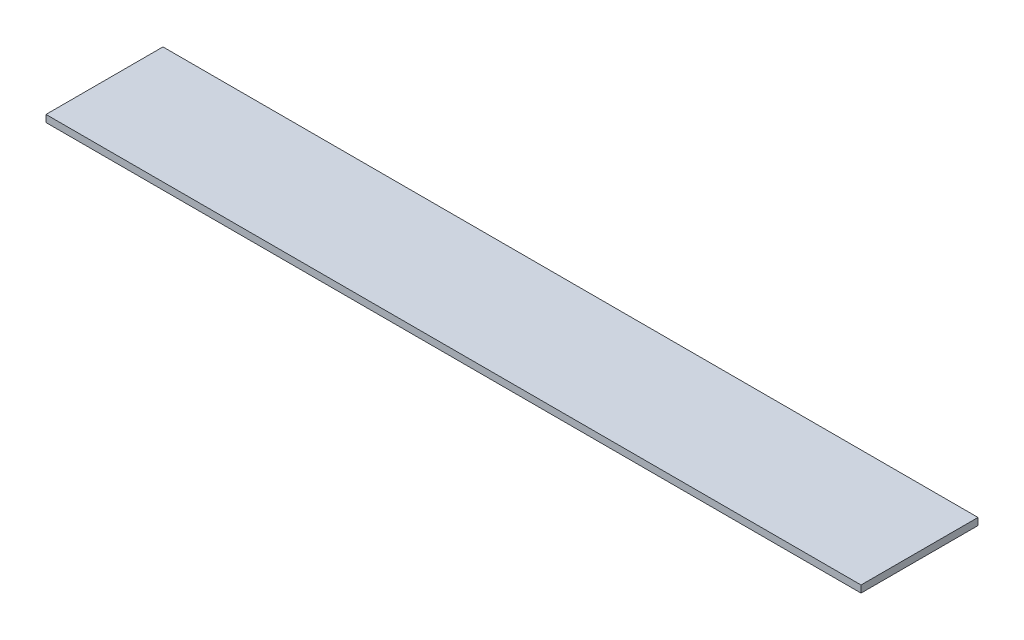
ISO-10303-21;
HEADER;
FILE_DESCRIPTION(('STEP AP214'),'2;1');
FILE_NAME('part.step','',(''),(''),'','','');
FILE_SCHEMA(('AUTOMOTIVE_DESIGN { 1 0 10303 214 1 1 1 1 }'));
ENDSEC;
DATA;
#1=APPLICATION_CONTEXT('core data for automotive mechanical design processes');
#2=APPLICATION_PROTOCOL_DEFINITION('international standard','automotive_design',2000,#1);
#3=PRODUCT_CONTEXT('',#1,'mechanical');
#4=PRODUCT('Part','Part','',(#3));
#5=PRODUCT_RELATED_PRODUCT_CATEGORY('part','',(#4));
#6=PRODUCT_DEFINITION_FORMATION('','',#4);
#7=PRODUCT_DEFINITION_CONTEXT('part definition',#1,'design');
#8=PRODUCT_DEFINITION('design','',#6,#7);
#9=PRODUCT_DEFINITION_SHAPE('','',#8);
#10=(LENGTH_UNIT() NAMED_UNIT(*) SI_UNIT(.MILLI.,.METRE.));
#11=(NAMED_UNIT(*) PLANE_ANGLE_UNIT() SI_UNIT($,.RADIAN.));
#12=(NAMED_UNIT(*) SI_UNIT($,.STERADIAN.) SOLID_ANGLE_UNIT());
#13=UNCERTAINTY_MEASURE_WITH_UNIT(LENGTH_MEASURE(1.E-05),#10,'distance_accuracy_value','');
#14=(GEOMETRIC_REPRESENTATION_CONTEXT(3) GLOBAL_UNCERTAINTY_ASSIGNED_CONTEXT((#13)) GLOBAL_UNIT_ASSIGNED_CONTEXT((#10,
#11,#12)) REPRESENTATION_CONTEXT('',''));
#15=CARTESIAN_POINT('',(0.,0.,0.));
#16=DIRECTION('',(0.,0.,1.));
#17=DIRECTION('',(1.,0.,0.));
#18=AXIS2_PLACEMENT_3D('',#15,#16,#17);
#19=CARTESIAN_POINT('',(-685.8,11.8872,-98.425));
#20=DIRECTION('',(1.,0.,0.));
#21=DIRECTION('',(0.,0.,-1.));
#22=AXIS2_PLACEMENT_3D('',#19,#20,#21);
#23=PLANE('',#22);
#24=DIRECTION('',(0.,0.,1.));
#25=VECTOR('',#24,1.);
#26=CARTESIAN_POINT('',(-685.8,0.,-98.425));
#27=LINE('',#26,#25);
#28=CARTESIAN_POINT('',(-685.8,0.,-98.425));
#29=VERTEX_POINT('',#28);
#30=CARTESIAN_POINT('',(-685.8,0.,98.425));
#31=VERTEX_POINT('',#30);
#32=EDGE_CURVE('E96',#29,#31,#27,.T.);
#33=ORIENTED_EDGE('',*,*,#32,.T.);
#34=DIRECTION('',(0.,-1.,0.));
#35=VECTOR('',#34,1.);
#36=CARTESIAN_POINT('',(-685.8,11.8872,98.425));
#37=LINE('',#36,#35);
#38=CARTESIAN_POINT('',(-685.8,11.8872,98.425));
#39=VERTEX_POINT('',#38);
#40=EDGE_CURVE('E11',#39,#31,#37,.T.);
#41=ORIENTED_EDGE('',*,*,#40,.F.);
#42=DIRECTION('',(0.,0.,1.));
#43=VECTOR('',#42,1.);
#44=CARTESIAN_POINT('',(-685.8,11.8872,-98.425));
#45=LINE('',#44,#43);
#46=CARTESIAN_POINT('',(-685.8,11.8872,-98.425));
#47=VERTEX_POINT('',#46);
#48=EDGE_CURVE('E84',#47,#39,#45,.T.);
#49=ORIENTED_EDGE('',*,*,#48,.F.);
#50=DIRECTION('',(0.,-1.,0.));
#51=VECTOR('',#50,1.);
#52=CARTESIAN_POINT('',(-685.8,11.8872,-98.425));
#53=LINE('',#52,#51);
#54=EDGE_CURVE('E92',#47,#29,#53,.T.);
#55=ORIENTED_EDGE('',*,*,#54,.T.);
#56=EDGE_LOOP('',(#33,#41,#49,#55));
#57=FACE_BOUND('',#56,.T.);
#58=ADVANCED_FACE('F33',(#57),#23,.F.);
#59=CARTESIAN_POINT('',(685.8,11.8872,98.425));
#60=DIRECTION('',(0.,0.,-1.));
#61=DIRECTION('',(-1.,0.,0.));
#62=AXIS2_PLACEMENT_3D('',#59,#60,#61);
#63=PLANE('',#62);
#64=DIRECTION('',(1.,0.,0.));
#65=VECTOR('',#64,1.);
#66=CARTESIAN_POINT('',(685.8,0.,98.425));
#67=LINE('',#66,#65);
#68=CARTESIAN_POINT('',(685.8,0.,98.425));
#69=VERTEX_POINT('',#68);
#70=EDGE_CURVE('E88',#31,#69,#67,.T.);
#71=ORIENTED_EDGE('',*,*,#70,.T.);
#72=DIRECTION('',(0.,-1.,0.));
#73=VECTOR('',#72,1.);
#74=CARTESIAN_POINT('',(685.8,11.8872,98.425));
#75=LINE('',#74,#73);
#76=CARTESIAN_POINT('',(685.8,11.8872,98.425));
#77=VERTEX_POINT('',#76);
#78=EDGE_CURVE('E41',#77,#69,#75,.T.);
#79=ORIENTED_EDGE('',*,*,#78,.F.);
#80=DIRECTION('',(1.,0.,0.));
#81=VECTOR('',#80,1.);
#82=CARTESIAN_POINT('',(685.8,11.8872,98.425));
#83=LINE('',#82,#81);
#84=EDGE_CURVE('E79',#39,#77,#83,.T.);
#85=ORIENTED_EDGE('',*,*,#84,.F.);
#86=ORIENTED_EDGE('',*,*,#40,.T.);
#87=EDGE_LOOP('',(#71,#79,#85,#86));
#88=FACE_BOUND('',#87,.T.);
#89=ADVANCED_FACE('F87',(#88),#63,.F.);
#90=CARTESIAN_POINT('',(685.8,11.8872,-98.425));
#91=DIRECTION('',(-1.,0.,0.));
#92=DIRECTION('',(0.,0.,1.));
#93=AXIS2_PLACEMENT_3D('',#90,#91,#92);
#94=PLANE('',#93);
#95=DIRECTION('',(0.,0.,-1.));
#96=VECTOR('',#95,1.);
#97=CARTESIAN_POINT('',(685.8,0.,-98.425));
#98=LINE('',#97,#96);
#99=CARTESIAN_POINT('',(685.8,0.,-98.425));
#100=VERTEX_POINT('',#99);
#101=EDGE_CURVE('E66',#69,#100,#98,.T.);
#102=ORIENTED_EDGE('',*,*,#101,.T.);
#103=DIRECTION('',(0.,-1.,0.));
#104=VECTOR('',#103,1.);
#105=CARTESIAN_POINT('',(685.8,11.8872,-98.425));
#106=LINE('',#105,#104);
#107=CARTESIAN_POINT('',(685.8,11.8872,-98.425));
#108=VERTEX_POINT('',#107);
#109=EDGE_CURVE('E89',#108,#100,#106,.T.);
#110=ORIENTED_EDGE('',*,*,#109,.F.);
#111=DIRECTION('',(0.,0.,-1.));
#112=VECTOR('',#111,1.);
#113=CARTESIAN_POINT('',(685.8,11.8872,-98.425));
#114=LINE('',#113,#112);
#115=EDGE_CURVE('E82',#77,#108,#114,.T.);
#116=ORIENTED_EDGE('',*,*,#115,.F.);
#117=ORIENTED_EDGE('',*,*,#78,.T.);
#118=EDGE_LOOP('',(#102,#110,#116,#117));
#119=FACE_BOUND('',#118,.T.);
#120=ADVANCED_FACE('F90',(#119),#94,.F.);
#121=CARTESIAN_POINT('',(685.8,11.8872,-98.425));
#122=DIRECTION('',(0.,0.,1.));
#123=DIRECTION('',(1.,0.,0.));
#124=AXIS2_PLACEMENT_3D('',#121,#122,#123);
#125=PLANE('',#124);
#126=DIRECTION('',(-1.,0.,0.));
#127=VECTOR('',#126,1.);
#128=CARTESIAN_POINT('',(685.8,0.,-98.425));
#129=LINE('',#128,#127);
#130=EDGE_CURVE('E72',#100,#29,#129,.T.);
#131=ORIENTED_EDGE('',*,*,#130,.T.);
#132=ORIENTED_EDGE('',*,*,#54,.F.);
#133=DIRECTION('',(-1.,0.,0.));
#134=VECTOR('',#133,1.);
#135=CARTESIAN_POINT('',(685.8,11.8872,-98.425));
#136=LINE('',#135,#134);
#137=EDGE_CURVE('E49',#108,#47,#136,.T.);
#138=ORIENTED_EDGE('',*,*,#137,.F.);
#139=ORIENTED_EDGE('',*,*,#109,.T.);
#140=EDGE_LOOP('',(#131,#132,#138,#139));
#141=FACE_BOUND('',#140,.T.);
#142=ADVANCED_FACE('F103',(#141),#125,.F.);
#143=CARTESIAN_POINT('',(0.,11.8872,0.));
#144=DIRECTION('',(0.,-1.,0.));
#145=DIRECTION('',(0.,0.,-1.));
#146=AXIS2_PLACEMENT_3D('',#143,#144,#145);
#147=PLANE('',#146);
#148=ORIENTED_EDGE('',*,*,#48,.T.);
#149=ORIENTED_EDGE('',*,*,#84,.T.);
#150=ORIENTED_EDGE('',*,*,#115,.T.);
#151=ORIENTED_EDGE('',*,*,#137,.T.);
#152=EDGE_LOOP('',(#148,#149,#150,#151));
#153=FACE_BOUND('',#152,.T.);
#154=ADVANCED_FACE('F80',(#153),#147,.F.);
#155=CARTESIAN_POINT('',(0.,0.,0.));
#156=DIRECTION('',(0.,-1.,0.));
#157=DIRECTION('',(0.,0.,-1.));
#158=AXIS2_PLACEMENT_3D('',#155,#156,#157);
#159=PLANE('',#158);
#160=ORIENTED_EDGE('',*,*,#32,.F.);
#161=ORIENTED_EDGE('',*,*,#130,.F.);
#162=ORIENTED_EDGE('',*,*,#101,.F.);
#163=ORIENTED_EDGE('',*,*,#70,.F.);
#164=EDGE_LOOP('',(#160,#161,#162,#163));
#165=FACE_BOUND('',#164,.T.);
#166=ADVANCED_FACE('F106',(#165),#159,.T.);
#167=CLOSED_SHELL('',(#58,#89,#120,#142,#154,#166));
#168=MANIFOLD_SOLID_BREP('B2',#167);
#169=ADVANCED_BREP_SHAPE_REPRESENTATION('',(#18,#168),#14);
#170=SHAPE_DEFINITION_REPRESENTATION(#9,#169);
ENDSEC;
END-ISO-10303-21;
